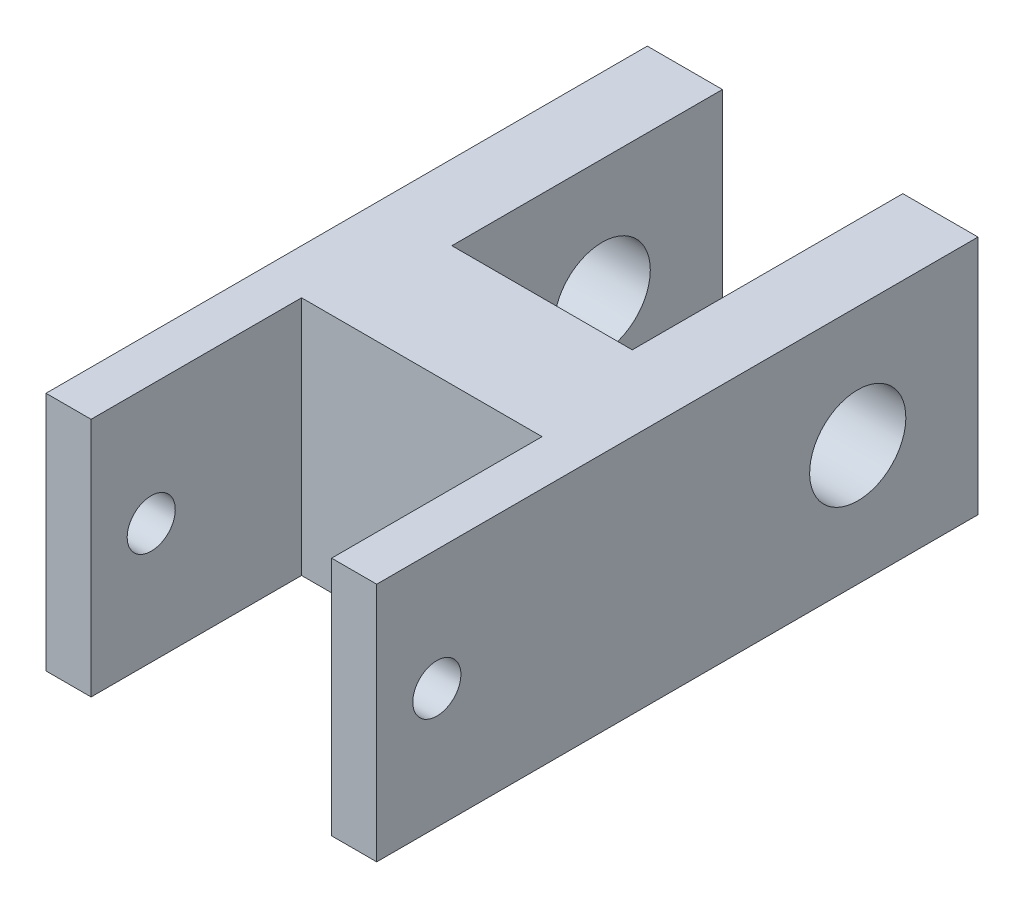
ISO-10303-21;
HEADER;
FILE_DESCRIPTION(('STEP AP214'),'2;1');
FILE_NAME('part.step','',(''),(''),'','','');
FILE_SCHEMA(('AUTOMOTIVE_DESIGN { 1 0 10303 214 1 1 1 1 }'));
ENDSEC;
DATA;
#1=APPLICATION_CONTEXT('core data for automotive mechanical design processes');
#2=APPLICATION_PROTOCOL_DEFINITION('international standard','automotive_design',2000,#1);
#3=PRODUCT_CONTEXT('',#1,'mechanical');
#4=PRODUCT('Part','Part','',(#3));
#5=PRODUCT_RELATED_PRODUCT_CATEGORY('part','',(#4));
#6=PRODUCT_DEFINITION_FORMATION('','',#4);
#7=PRODUCT_DEFINITION_CONTEXT('part definition',#1,'design');
#8=PRODUCT_DEFINITION('design','',#6,#7);
#9=PRODUCT_DEFINITION_SHAPE('','',#8);
#10=(LENGTH_UNIT() NAMED_UNIT(*) SI_UNIT(.MILLI.,.METRE.));
#11=(NAMED_UNIT(*) PLANE_ANGLE_UNIT() SI_UNIT($,.RADIAN.));
#12=(NAMED_UNIT(*) SI_UNIT($,.STERADIAN.) SOLID_ANGLE_UNIT());
#13=UNCERTAINTY_MEASURE_WITH_UNIT(LENGTH_MEASURE(1.E-05),#10,'distance_accuracy_value','');
#14=(GEOMETRIC_REPRESENTATION_CONTEXT(3) GLOBAL_UNCERTAINTY_ASSIGNED_CONTEXT((#13)) GLOBAL_UNIT_ASSIGNED_CONTEXT((#10,
#11,#12)) REPRESENTATION_CONTEXT('',''));
#15=CARTESIAN_POINT('',(0.,0.,0.));
#16=DIRECTION('',(0.,0.,1.));
#17=DIRECTION('',(1.,0.,0.));
#18=AXIS2_PLACEMENT_3D('',#15,#16,#17);
#19=CARTESIAN_POINT('',(0.,0.,0.));
#20=DIRECTION('',(0.,0.,-1.));
#21=DIRECTION('',(-1.,0.,0.));
#22=AXIS2_PLACEMENT_3D('',#19,#20,#21);
#23=PLANE('',#22);
#24=DIRECTION('',(0.,-1.,0.));
#25=VECTOR('',#24,1.);
#26=CARTESIAN_POINT('',(42.5,40.,0.));
#27=LINE('',#26,#25);
#28=CARTESIAN_POINT('',(42.5,40.,0.));
#29=VERTEX_POINT('',#28);
#30=CARTESIAN_POINT('',(42.5,0.,0.));
#31=VERTEX_POINT('',#30);
#32=EDGE_CURVE('E131',#29,#31,#27,.T.);
#33=ORIENTED_EDGE('',*,*,#32,.F.);
#34=DIRECTION('',(-1.,0.,0.));
#35=VECTOR('',#34,1.);
#36=CARTESIAN_POINT('',(0.,40.,0.));
#37=LINE('',#36,#35);
#38=CARTESIAN_POINT('',(55.,40.,0.));
#39=VERTEX_POINT('',#38);
#40=EDGE_CURVE('E208',#39,#29,#37,.T.);
#41=ORIENTED_EDGE('',*,*,#40,.F.);
#42=DIRECTION('',(0.,1.,0.));
#43=VECTOR('',#42,1.);
#44=CARTESIAN_POINT('',(55.,0.,0.));
#45=LINE('',#44,#43);
#46=CARTESIAN_POINT('',(55.,0.,0.));
#47=VERTEX_POINT('',#46);
#48=EDGE_CURVE('E224',#47,#39,#45,.T.);
#49=ORIENTED_EDGE('',*,*,#48,.F.);
#50=DIRECTION('',(1.,0.,0.));
#51=VECTOR('',#50,1.);
#52=CARTESIAN_POINT('',(0.,0.,0.));
#53=LINE('',#52,#51);
#54=EDGE_CURVE('E221',#31,#47,#53,.T.);
#55=ORIENTED_EDGE('',*,*,#54,.F.);
#56=EDGE_LOOP('',(#33,#41,#49,#55));
#57=FACE_BOUND('',#56,.T.);
#58=ADVANCED_FACE('F34',(#57),#23,.T.);
#59=CARTESIAN_POINT('',(0.,20.,20.));
#60=DIRECTION('',(1.,0.,0.));
#61=DIRECTION('',(0.,1.,0.));
#62=AXIS2_PLACEMENT_3D('',#59,#60,#61);
#63=CYLINDRICAL_SURFACE('',#62,8.);
#64=CARTESIAN_POINT('',(42.5,20.,20.));
#65=DIRECTION('',(1.,0.,0.));
#66=DIRECTION('',(0.,1.,0.));
#67=AXIS2_PLACEMENT_3D('',#64,#65,#66);
#68=CIRCLE('',#67,8.);
#69=CARTESIAN_POINT('',(42.5,28.,20.));
#70=VERTEX_POINT('',#69);
#71=EDGE_CURVE('E38',#70,#70,#68,.F.);
#72=ORIENTED_EDGE('',*,*,#71,.T.);
#73=EDGE_LOOP('',(#72));
#74=FACE_BOUND('',#73,.T.);
#75=CARTESIAN_POINT('',(55.,20.,20.));
#76=DIRECTION('',(1.,0.,0.));
#77=DIRECTION('',(0.,1.,0.));
#78=AXIS2_PLACEMENT_3D('',#75,#76,#77);
#79=CIRCLE('',#78,8.);
#80=CARTESIAN_POINT('',(55.,28.,20.));
#81=VERTEX_POINT('',#80);
#82=EDGE_CURVE('E172',#81,#81,#79,.T.);
#83=ORIENTED_EDGE('',*,*,#82,.T.);
#84=EDGE_LOOP('',(#83));
#85=FACE_BOUND('',#84,.T.);
#86=ADVANCED_FACE('F243',(#74,#85),#63,.F.);
#87=CARTESIAN_POINT('',(0.,0.,100.));
#88=DIRECTION('',(0.,0.,-1.));
#89=DIRECTION('',(-1.,0.,0.));
#90=AXIS2_PLACEMENT_3D('',#87,#88,#89);
#91=PLANE('',#90);
#92=DIRECTION('',(1.,0.,0.));
#93=VECTOR('',#92,1.);
#94=CARTESIAN_POINT('',(0.,0.,100.));
#95=LINE('',#94,#93);
#96=CARTESIAN_POINT('',(0.,0.,100.));
#97=VERTEX_POINT('',#96);
#98=CARTESIAN_POINT('',(7.49999999999999,0.,100.));
#99=VERTEX_POINT('',#98);
#100=EDGE_CURVE('E209',#97,#99,#95,.T.);
#101=ORIENTED_EDGE('',*,*,#100,.T.);
#102=DIRECTION('',(0.,-1.,0.));
#103=VECTOR('',#102,1.);
#104=CARTESIAN_POINT('',(7.49999999999999,0.,100.));
#105=LINE('',#104,#103);
#106=CARTESIAN_POINT('',(7.49999999999999,40.,100.));
#107=VERTEX_POINT('',#106);
#108=EDGE_CURVE('E178',#107,#99,#105,.T.);
#109=ORIENTED_EDGE('',*,*,#108,.F.);
#110=DIRECTION('',(-1.,0.,0.));
#111=VECTOR('',#110,1.);
#112=CARTESIAN_POINT('',(0.,40.,100.));
#113=LINE('',#112,#111);
#114=CARTESIAN_POINT('',(0.,40.,100.));
#115=VERTEX_POINT('',#114);
#116=EDGE_CURVE('E214',#107,#115,#113,.T.);
#117=ORIENTED_EDGE('',*,*,#116,.T.);
#118=DIRECTION('',(0.,-1.,0.));
#119=VECTOR('',#118,1.);
#120=CARTESIAN_POINT('',(0.,0.,100.));
#121=LINE('',#120,#119);
#122=EDGE_CURVE('E204',#115,#97,#121,.T.);
#123=ORIENTED_EDGE('',*,*,#122,.T.);
#124=EDGE_LOOP('',(#101,#109,#117,#123));
#125=FACE_BOUND('',#124,.T.);
#126=ADVANCED_FACE('F264',(#125),#91,.F.);
#127=CARTESIAN_POINT('',(0.,0.,100.));
#128=DIRECTION('',(1.,0.,0.));
#129=DIRECTION('',(0.,1.,0.));
#130=AXIS2_PLACEMENT_3D('',#127,#128,#129);
#131=PLANE('',#130);
#132=CARTESIAN_POINT('',(0.,20.,90.));
#133=DIRECTION('',(1.,0.,0.));
#134=DIRECTION('',(0.,1.,0.));
#135=AXIS2_PLACEMENT_3D('',#132,#133,#134);
#136=CIRCLE('',#135,4.00000000000001);
#137=CARTESIAN_POINT('',(0.,24.,90.));
#138=VERTEX_POINT('',#137);
#139=EDGE_CURVE('E162',#138,#138,#136,.T.);
#140=ORIENTED_EDGE('',*,*,#139,.T.);
#141=EDGE_LOOP('',(#140));
#142=FACE_BOUND('',#141,.T.);
#143=CARTESIAN_POINT('',(0.,20.,20.));
#144=DIRECTION('',(1.,0.,0.));
#145=DIRECTION('',(0.,1.,0.));
#146=AXIS2_PLACEMENT_3D('',#143,#144,#145);
#147=CIRCLE('',#146,8.);
#148=CARTESIAN_POINT('',(0.,28.,20.));
#149=VERTEX_POINT('',#148);
#150=EDGE_CURVE('E169',#149,#149,#147,.T.);
#151=ORIENTED_EDGE('',*,*,#150,.T.);
#152=EDGE_LOOP('',(#151));
#153=FACE_BOUND('',#152,.T.);
#154=DIRECTION('',(0.,-1.,0.));
#155=VECTOR('',#154,1.);
#156=CARTESIAN_POINT('',(0.,0.,0.));
#157=LINE('',#156,#155);
#158=CARTESIAN_POINT('',(0.,40.,0.));
#159=VERTEX_POINT('',#158);
#160=CARTESIAN_POINT('',(0.,0.,0.));
#161=VERTEX_POINT('',#160);
#162=EDGE_CURVE('E197',#159,#161,#157,.T.);
#163=ORIENTED_EDGE('',*,*,#162,.T.);
#164=DIRECTION('',(0.,0.,-1.));
#165=VECTOR('',#164,1.);
#166=CARTESIAN_POINT('',(0.,0.,100.));
#167=LINE('',#166,#165);
#168=EDGE_CURVE('E11',#97,#161,#167,.T.);
#169=ORIENTED_EDGE('',*,*,#168,.F.);
#170=ORIENTED_EDGE('',*,*,#122,.F.);
#171=DIRECTION('',(0.,0.,-1.));
#172=VECTOR('',#171,1.);
#173=CARTESIAN_POINT('',(0.,40.,100.));
#174=LINE('',#173,#172);
#175=EDGE_CURVE('E218',#115,#159,#174,.T.);
#176=ORIENTED_EDGE('',*,*,#175,.T.);
#177=EDGE_LOOP('',(#163,#169,#170,#176));
#178=FACE_BOUND('',#177,.T.);
#179=ADVANCED_FACE('F36',(#142,#153,#178),#131,.F.);
#180=CARTESIAN_POINT('',(0.,0.,100.));
#181=DIRECTION('',(0.,1.,0.));
#182=DIRECTION('',(0.,0.,1.));
#183=AXIS2_PLACEMENT_3D('',#180,#181,#182);
#184=PLANE('',#183);
#185=DIRECTION('',(-1.,0.,0.));
#186=VECTOR('',#185,1.);
#187=CARTESIAN_POINT('',(42.5,0.,45.));
#188=LINE('',#187,#186);
#189=CARTESIAN_POINT('',(42.5,0.,45.));
#190=VERTEX_POINT('',#189);
#191=CARTESIAN_POINT('',(12.5,0.,45.));
#192=VERTEX_POINT('',#191);
#193=EDGE_CURVE('E141',#190,#192,#188,.T.);
#194=ORIENTED_EDGE('',*,*,#193,.F.);
#195=DIRECTION('',(0.,0.,-1.));
#196=VECTOR('',#195,1.);
#197=CARTESIAN_POINT('',(42.5,0.,45.));
#198=LINE('',#197,#196);
#199=EDGE_CURVE('E124',#190,#31,#198,.T.);
#200=ORIENTED_EDGE('',*,*,#199,.T.);
#201=ORIENTED_EDGE('',*,*,#54,.T.);
#202=DIRECTION('',(0.,0.,-1.));
#203=VECTOR('',#202,1.);
#204=CARTESIAN_POINT('',(55.,0.,100.));
#205=LINE('',#204,#203);
#206=CARTESIAN_POINT('',(55.,0.,100.));
#207=VERTEX_POINT('',#206);
#208=EDGE_CURVE('E43',#207,#47,#205,.T.);
#209=ORIENTED_EDGE('',*,*,#208,.F.);
#210=CARTESIAN_POINT('',(47.5,0.,100.));
#211=VERTEX_POINT('',#210);
#212=EDGE_CURVE('E207',#211,#207,#95,.T.);
#213=ORIENTED_EDGE('',*,*,#212,.F.);
#214=DIRECTION('',(0.,0.,1.));
#215=VECTOR('',#214,1.);
#216=CARTESIAN_POINT('',(47.5,0.,65.));
#217=LINE('',#216,#215);
#218=CARTESIAN_POINT('',(47.5,0.,65.));
#219=VERTEX_POINT('',#218);
#220=EDGE_CURVE('E59',#219,#211,#217,.T.);
#221=ORIENTED_EDGE('',*,*,#220,.F.);
#222=DIRECTION('',(1.,0.,0.));
#223=VECTOR('',#222,1.);
#224=CARTESIAN_POINT('',(7.49999999999999,0.,65.));
#225=LINE('',#224,#223);
#226=CARTESIAN_POINT('',(7.49999999999999,0.,65.));
#227=VERTEX_POINT('',#226);
#228=EDGE_CURVE('E182',#227,#219,#225,.T.);
#229=ORIENTED_EDGE('',*,*,#228,.F.);
#230=DIRECTION('',(0.,0.,1.));
#231=VECTOR('',#230,1.);
#232=CARTESIAN_POINT('',(7.49999999999999,0.,65.));
#233=LINE('',#232,#231);
#234=EDGE_CURVE('E192',#227,#99,#233,.T.);
#235=ORIENTED_EDGE('',*,*,#234,.T.);
#236=ORIENTED_EDGE('',*,*,#100,.F.);
#237=ORIENTED_EDGE('',*,*,#168,.T.);
#238=CARTESIAN_POINT('',(12.5,0.,0.));
#239=VERTEX_POINT('',#238);
#240=EDGE_CURVE('E222',#161,#239,#53,.T.);
#241=ORIENTED_EDGE('',*,*,#240,.T.);
#242=DIRECTION('',(0.,0.,-1.));
#243=VECTOR('',#242,1.);
#244=CARTESIAN_POINT('',(12.5,0.,45.));
#245=LINE('',#244,#243);
#246=EDGE_CURVE('E51',#192,#239,#245,.T.);
#247=ORIENTED_EDGE('',*,*,#246,.F.);
#248=EDGE_LOOP('',(#194,#200,#201,#209,#213,#221,#229,#235,#236,#237,#241,#247));
#249=FACE_BOUND('',#248,.T.);
#250=ADVANCED_FACE('F146',(#249),#184,.F.);
#251=CARTESIAN_POINT('',(55.,0.,100.));
#252=DIRECTION('',(-1.,0.,0.));
#253=DIRECTION('',(0.,-1.,0.));
#254=AXIS2_PLACEMENT_3D('',#251,#252,#253);
#255=PLANE('',#254);
#256=CARTESIAN_POINT('',(55.,20.,90.));
#257=DIRECTION('',(1.,0.,0.));
#258=DIRECTION('',(0.,1.,0.));
#259=AXIS2_PLACEMENT_3D('',#256,#257,#258);
#260=CIRCLE('',#259,4.00000000000001);
#261=CARTESIAN_POINT('',(55.,24.,90.));
#262=VERTEX_POINT('',#261);
#263=EDGE_CURVE('E166',#262,#262,#260,.T.);
#264=ORIENTED_EDGE('',*,*,#263,.F.);
#265=EDGE_LOOP('',(#264));
#266=FACE_BOUND('',#265,.T.);
#267=ORIENTED_EDGE('',*,*,#82,.F.);
#268=EDGE_LOOP('',(#267));
#269=FACE_BOUND('',#268,.T.);
#270=ORIENTED_EDGE('',*,*,#48,.T.);
#271=DIRECTION('',(0.,0.,-1.));
#272=VECTOR('',#271,1.);
#273=CARTESIAN_POINT('',(55.,40.,100.));
#274=LINE('',#273,#272);
#275=CARTESIAN_POINT('',(55.,40.,100.));
#276=VERTEX_POINT('',#275);
#277=EDGE_CURVE('E231',#276,#39,#274,.T.);
#278=ORIENTED_EDGE('',*,*,#277,.F.);
#279=DIRECTION('',(0.,1.,0.));
#280=VECTOR('',#279,1.);
#281=CARTESIAN_POINT('',(55.,0.,100.));
#282=LINE('',#281,#280);
#283=EDGE_CURVE('E212',#207,#276,#282,.T.);
#284=ORIENTED_EDGE('',*,*,#283,.F.);
#285=ORIENTED_EDGE('',*,*,#208,.T.);
#286=EDGE_LOOP('',(#270,#278,#284,#285));
#287=FACE_BOUND('',#286,.T.);
#288=ADVANCED_FACE('F296',(#266,#269,#287),#255,.F.);
#289=CARTESIAN_POINT('',(0.,40.,100.));
#290=DIRECTION('',(0.,-1.,0.));
#291=DIRECTION('',(0.,0.,-1.));
#292=AXIS2_PLACEMENT_3D('',#289,#290,#291);
#293=PLANE('',#292);
#294=ORIENTED_EDGE('',*,*,#40,.T.);
#295=DIRECTION('',(0.,0.,-1.));
#296=VECTOR('',#295,1.);
#297=CARTESIAN_POINT('',(42.5,40.,45.));
#298=LINE('',#297,#296);
#299=CARTESIAN_POINT('',(42.5,40.,45.));
#300=VERTEX_POINT('',#299);
#301=EDGE_CURVE('E155',#300,#29,#298,.T.);
#302=ORIENTED_EDGE('',*,*,#301,.F.);
#303=DIRECTION('',(1.,0.,0.));
#304=VECTOR('',#303,1.);
#305=CARTESIAN_POINT('',(42.5,40.,45.));
#306=LINE('',#305,#304);
#307=CARTESIAN_POINT('',(12.5,40.,45.));
#308=VERTEX_POINT('',#307);
#309=EDGE_CURVE('E135',#308,#300,#306,.T.);
#310=ORIENTED_EDGE('',*,*,#309,.F.);
#311=DIRECTION('',(0.,0.,-1.));
#312=VECTOR('',#311,1.);
#313=CARTESIAN_POINT('',(12.5,40.,45.));
#314=LINE('',#313,#312);
#315=CARTESIAN_POINT('',(12.5,40.,0.));
#316=VERTEX_POINT('',#315);
#317=EDGE_CURVE('E158',#308,#316,#314,.T.);
#318=ORIENTED_EDGE('',*,*,#317,.T.);
#319=EDGE_CURVE('E226',#316,#159,#37,.T.);
#320=ORIENTED_EDGE('',*,*,#319,.T.);
#321=ORIENTED_EDGE('',*,*,#175,.F.);
#322=ORIENTED_EDGE('',*,*,#116,.F.);
#323=DIRECTION('',(0.,0.,1.));
#324=VECTOR('',#323,1.);
#325=CARTESIAN_POINT('',(7.49999999999999,40.,65.));
#326=LINE('',#325,#324);
#327=CARTESIAN_POINT('',(7.49999999999999,40.,65.));
#328=VERTEX_POINT('',#327);
#329=EDGE_CURVE('E195',#328,#107,#326,.T.);
#330=ORIENTED_EDGE('',*,*,#329,.F.);
#331=DIRECTION('',(-1.,0.,0.));
#332=VECTOR('',#331,1.);
#333=CARTESIAN_POINT('',(7.49999999999999,40.,65.));
#334=LINE('',#333,#332);
#335=CARTESIAN_POINT('',(47.5,40.,65.));
#336=VERTEX_POINT('',#335);
#337=EDGE_CURVE('E189',#336,#328,#334,.T.);
#338=ORIENTED_EDGE('',*,*,#337,.F.);
#339=DIRECTION('',(0.,0.,1.));
#340=VECTOR('',#339,1.);
#341=CARTESIAN_POINT('',(47.5,40.,65.));
#342=LINE('',#341,#340);
#343=CARTESIAN_POINT('',(47.5,40.,100.));
#344=VERTEX_POINT('',#343);
#345=EDGE_CURVE('E198',#336,#344,#342,.T.);
#346=ORIENTED_EDGE('',*,*,#345,.T.);
#347=EDGE_CURVE('E215',#276,#344,#113,.T.);
#348=ORIENTED_EDGE('',*,*,#347,.F.);
#349=ORIENTED_EDGE('',*,*,#277,.T.);
#350=EDGE_LOOP('',(#294,#302,#310,#318,#320,#321,#322,#330,#338,#346,#348,#349));
#351=FACE_BOUND('',#350,.T.);
#352=ADVANCED_FACE('F278',(#351),#293,.F.);
#353=ORIENTED_EDGE('',*,*,#347,.T.);
#354=DIRECTION('',(0.,1.,0.));
#355=VECTOR('',#354,1.);
#356=CARTESIAN_POINT('',(47.5,0.,100.));
#357=LINE('',#356,#355);
#358=EDGE_CURVE('E183',#211,#344,#357,.T.);
#359=ORIENTED_EDGE('',*,*,#358,.F.);
#360=ORIENTED_EDGE('',*,*,#212,.T.);
#361=ORIENTED_EDGE('',*,*,#283,.T.);
#362=EDGE_LOOP('',(#353,#359,#360,#361));
#363=FACE_BOUND('',#362,.T.);
#364=ADVANCED_FACE('F269',(#363),#91,.F.);
#365=DIRECTION('',(0.,1.,0.));
#366=VECTOR('',#365,1.);
#367=CARTESIAN_POINT('',(12.5,40.,0.));
#368=LINE('',#367,#366);
#369=EDGE_CURVE('E144',#239,#316,#368,.T.);
#370=ORIENTED_EDGE('',*,*,#369,.F.);
#371=ORIENTED_EDGE('',*,*,#240,.F.);
#372=ORIENTED_EDGE('',*,*,#162,.F.);
#373=ORIENTED_EDGE('',*,*,#319,.F.);
#374=EDGE_LOOP('',(#370,#371,#372,#373));
#375=FACE_BOUND('',#374,.T.);
#376=ADVANCED_FACE('F260',(#375),#23,.T.);
#377=CARTESIAN_POINT('',(7.49999999999999,0.,65.));
#378=DIRECTION('',(-1.,0.,0.));
#379=DIRECTION('',(0.,0.,1.));
#380=AXIS2_PLACEMENT_3D('',#377,#378,#379);
#381=PLANE('',#380);
#382=CARTESIAN_POINT('',(7.49999999999999,20.,90.));
#383=DIRECTION('',(-1.,0.,0.));
#384=DIRECTION('',(0.,0.,1.));
#385=AXIS2_PLACEMENT_3D('',#382,#383,#384);
#386=CIRCLE('',#385,4.00000000000001);
#387=CARTESIAN_POINT('',(7.49999999999999,20.,94.));
#388=VERTEX_POINT('',#387);
#389=EDGE_CURVE('E175',#388,#388,#386,.T.);
#390=ORIENTED_EDGE('',*,*,#389,.T.);
#391=EDGE_LOOP('',(#390));
#392=FACE_BOUND('',#391,.T.);
#393=ORIENTED_EDGE('',*,*,#108,.T.);
#394=ORIENTED_EDGE('',*,*,#234,.F.);
#395=DIRECTION('',(0.,-1.,0.));
#396=VECTOR('',#395,1.);
#397=CARTESIAN_POINT('',(7.49999999999999,0.,65.));
#398=LINE('',#397,#396);
#399=EDGE_CURVE('E179',#328,#227,#398,.T.);
#400=ORIENTED_EDGE('',*,*,#399,.F.);
#401=ORIENTED_EDGE('',*,*,#329,.T.);
#402=EDGE_LOOP('',(#393,#394,#400,#401));
#403=FACE_BOUND('',#402,.T.);
#404=ADVANCED_FACE('F268',(#392,#403),#381,.F.);
#405=CARTESIAN_POINT('',(47.5,0.,65.));
#406=DIRECTION('',(1.,0.,0.));
#407=DIRECTION('',(0.,0.,-1.));
#408=AXIS2_PLACEMENT_3D('',#405,#406,#407);
#409=PLANE('',#408);
#410=CARTESIAN_POINT('',(47.5,20.,90.));
#411=DIRECTION('',(1.,0.,0.));
#412=DIRECTION('',(0.,0.,-1.));
#413=AXIS2_PLACEMENT_3D('',#410,#411,#412);
#414=CIRCLE('',#413,4.00000000000001);
#415=CARTESIAN_POINT('',(47.5,20.,86.));
#416=VERTEX_POINT('',#415);
#417=EDGE_CURVE('E165',#416,#416,#414,.T.);
#418=ORIENTED_EDGE('',*,*,#417,.T.);
#419=EDGE_LOOP('',(#418));
#420=FACE_BOUND('',#419,.T.);
#421=ORIENTED_EDGE('',*,*,#358,.T.);
#422=ORIENTED_EDGE('',*,*,#345,.F.);
#423=DIRECTION('',(0.,1.,0.));
#424=VECTOR('',#423,1.);
#425=CARTESIAN_POINT('',(47.5,0.,65.));
#426=LINE('',#425,#424);
#427=EDGE_CURVE('E186',#219,#336,#426,.T.);
#428=ORIENTED_EDGE('',*,*,#427,.F.);
#429=ORIENTED_EDGE('',*,*,#220,.T.);
#430=EDGE_LOOP('',(#421,#422,#428,#429));
#431=FACE_BOUND('',#430,.T.);
#432=ADVANCED_FACE('F275',(#420,#431),#409,.F.);
#433=CARTESIAN_POINT('',(0.,0.,65.));
#434=DIRECTION('',(0.,0.,-1.));
#435=DIRECTION('',(-1.,0.,0.));
#436=AXIS2_PLACEMENT_3D('',#433,#434,#435);
#437=PLANE('',#436);
#438=ORIENTED_EDGE('',*,*,#399,.T.);
#439=ORIENTED_EDGE('',*,*,#228,.T.);
#440=ORIENTED_EDGE('',*,*,#427,.T.);
#441=ORIENTED_EDGE('',*,*,#337,.T.);
#442=EDGE_LOOP('',(#438,#439,#440,#441));
#443=FACE_BOUND('',#442,.T.);
#444=ADVANCED_FACE('F301',(#443),#437,.F.);
#445=CARTESIAN_POINT('',(0.,20.,90.));
#446=DIRECTION('',(1.,0.,0.));
#447=DIRECTION('',(0.,1.,0.));
#448=AXIS2_PLACEMENT_3D('',#445,#446,#447);
#449=CYLINDRICAL_SURFACE('',#448,4.00000000000001);
#450=ORIENTED_EDGE('',*,*,#263,.T.);
#451=EDGE_LOOP('',(#450));
#452=FACE_BOUND('',#451,.T.);
#453=ORIENTED_EDGE('',*,*,#417,.F.);
#454=EDGE_LOOP('',(#453));
#455=FACE_BOUND('',#454,.T.);
#456=ADVANCED_FACE('F316',(#452,#455),#449,.F.);
#457=ORIENTED_EDGE('',*,*,#139,.F.);
#458=EDGE_LOOP('',(#457));
#459=FACE_BOUND('',#458,.T.);
#460=ORIENTED_EDGE('',*,*,#389,.F.);
#461=EDGE_LOOP('',(#460));
#462=FACE_BOUND('',#461,.T.);
#463=ADVANCED_FACE('F254',(#459,#462),#449,.F.);
#464=CARTESIAN_POINT('',(12.5,20.,20.));
#465=DIRECTION('',(-1.,0.,0.));
#466=DIRECTION('',(0.,-1.,0.));
#467=AXIS2_PLACEMENT_3D('',#464,#465,#466);
#468=CIRCLE('',#467,8.);
#469=CARTESIAN_POINT('',(12.5,12.,20.));
#470=VERTEX_POINT('',#469);
#471=EDGE_CURVE('E157',#470,#470,#468,.F.);
#472=ORIENTED_EDGE('',*,*,#471,.T.);
#473=EDGE_LOOP('',(#472));
#474=FACE_BOUND('',#473,.T.);
#475=ORIENTED_EDGE('',*,*,#150,.F.);
#476=EDGE_LOOP('',(#475));
#477=FACE_BOUND('',#476,.T.);
#478=ADVANCED_FACE('F247',(#474,#477),#63,.F.);
#479=CARTESIAN_POINT('',(42.5,40.,45.));
#480=DIRECTION('',(1.,0.,0.));
#481=DIRECTION('',(0.,1.,0.));
#482=AXIS2_PLACEMENT_3D('',#479,#480,#481);
#483=PLANE('',#482);
#484=ORIENTED_EDGE('',*,*,#32,.T.);
#485=ORIENTED_EDGE('',*,*,#199,.F.);
#486=DIRECTION('',(0.,-1.,0.));
#487=VECTOR('',#486,1.);
#488=CARTESIAN_POINT('',(42.5,40.,45.));
#489=LINE('',#488,#487);
#490=EDGE_CURVE('E128',#300,#190,#489,.T.);
#491=ORIENTED_EDGE('',*,*,#490,.F.);
#492=ORIENTED_EDGE('',*,*,#301,.T.);
#493=EDGE_LOOP('',(#484,#485,#491,#492));
#494=FACE_BOUND('',#493,.T.);
#495=ORIENTED_EDGE('',*,*,#71,.F.);
#496=EDGE_LOOP('',(#495));
#497=FACE_BOUND('',#496,.T.);
#498=ADVANCED_FACE('F126',(#494,#497),#483,.F.);
#499=CARTESIAN_POINT('',(12.5,40.,45.));
#500=DIRECTION('',(-1.,0.,0.));
#501=DIRECTION('',(0.,-1.,0.));
#502=AXIS2_PLACEMENT_3D('',#499,#500,#501);
#503=PLANE('',#502);
#504=ORIENTED_EDGE('',*,*,#369,.T.);
#505=ORIENTED_EDGE('',*,*,#317,.F.);
#506=DIRECTION('',(0.,1.,0.));
#507=VECTOR('',#506,1.);
#508=CARTESIAN_POINT('',(12.5,40.,45.));
#509=LINE('',#508,#507);
#510=EDGE_CURVE('E148',#192,#308,#509,.T.);
#511=ORIENTED_EDGE('',*,*,#510,.F.);
#512=ORIENTED_EDGE('',*,*,#246,.T.);
#513=EDGE_LOOP('',(#504,#505,#511,#512));
#514=FACE_BOUND('',#513,.T.);
#515=ORIENTED_EDGE('',*,*,#471,.F.);
#516=EDGE_LOOP('',(#515));
#517=FACE_BOUND('',#516,.T.);
#518=ADVANCED_FACE('F246',(#514,#517),#503,.F.);
#519=CARTESIAN_POINT('',(0.,0.,45.));
#520=DIRECTION('',(0.,0.,-1.));
#521=DIRECTION('',(-1.,0.,0.));
#522=AXIS2_PLACEMENT_3D('',#519,#520,#521);
#523=PLANE('',#522);
#524=ORIENTED_EDGE('',*,*,#490,.T.);
#525=ORIENTED_EDGE('',*,*,#193,.T.);
#526=ORIENTED_EDGE('',*,*,#510,.T.);
#527=ORIENTED_EDGE('',*,*,#309,.T.);
#528=EDGE_LOOP('',(#524,#525,#526,#527));
#529=FACE_BOUND('',#528,.T.);
#530=ADVANCED_FACE('F139',(#529),#523,.T.);
#531=CLOSED_SHELL('',(#58,#86,#126,#179,#250,#288,#352,#364,#376,#404,#432,#444,#456,#463,#478,
#498,#518,#530));
#532=MANIFOLD_SOLID_BREP('B2',#531);
#533=ADVANCED_BREP_SHAPE_REPRESENTATION('',(#18,#532),#14);
#534=SHAPE_DEFINITION_REPRESENTATION(#9,#533);
ENDSEC;
END-ISO-10303-21;
